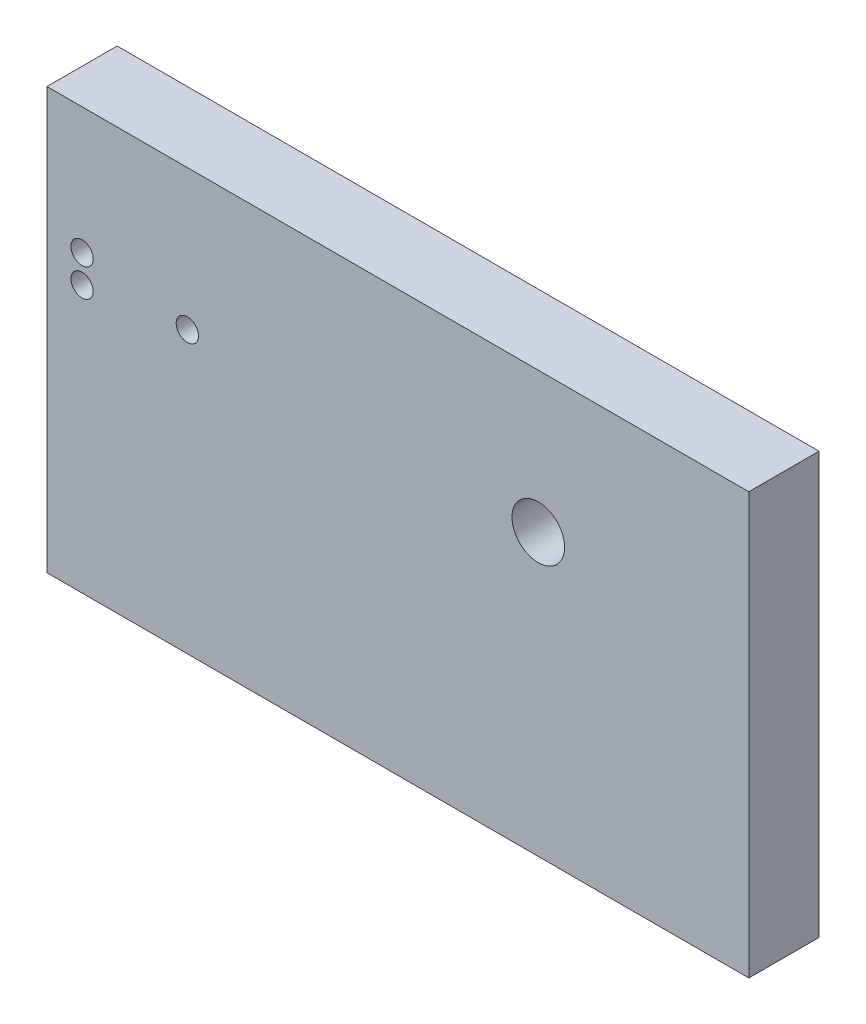
ISO-10303-21;
HEADER;
FILE_DESCRIPTION(('STEP AP214'),'2;1');
FILE_NAME('part.step','',(''),(''),'','','');
FILE_SCHEMA(('AUTOMOTIVE_DESIGN { 1 0 10303 214 1 1 1 1 }'));
ENDSEC;
DATA;
#1=APPLICATION_CONTEXT('core data for automotive mechanical design processes');
#2=APPLICATION_PROTOCOL_DEFINITION('international standard','automotive_design',2000,#1);
#3=PRODUCT_CONTEXT('',#1,'mechanical');
#4=PRODUCT('Part','Part','',(#3));
#5=PRODUCT_RELATED_PRODUCT_CATEGORY('part','',(#4));
#6=PRODUCT_DEFINITION_FORMATION('','',#4);
#7=PRODUCT_DEFINITION_CONTEXT('part definition',#1,'design');
#8=PRODUCT_DEFINITION('design','',#6,#7);
#9=PRODUCT_DEFINITION_SHAPE('','',#8);
#10=(LENGTH_UNIT() NAMED_UNIT(*) SI_UNIT(.MILLI.,.METRE.));
#11=(NAMED_UNIT(*) PLANE_ANGLE_UNIT() SI_UNIT($,.RADIAN.));
#12=(NAMED_UNIT(*) SI_UNIT($,.STERADIAN.) SOLID_ANGLE_UNIT());
#13=UNCERTAINTY_MEASURE_WITH_UNIT(LENGTH_MEASURE(1.E-05),#10,'distance_accuracy_value','');
#14=(GEOMETRIC_REPRESENTATION_CONTEXT(3) GLOBAL_UNCERTAINTY_ASSIGNED_CONTEXT((#13)) GLOBAL_UNIT_ASSIGNED_CONTEXT((#10,
#11,#12)) REPRESENTATION_CONTEXT('',''));
#15=CARTESIAN_POINT('',(0.,0.,0.));
#16=DIRECTION('',(0.,0.,1.));
#17=DIRECTION('',(1.,0.,0.));
#18=AXIS2_PLACEMENT_3D('',#15,#16,#17);
#19=CARTESIAN_POINT('',(0.,76.2,12.7));
#20=DIRECTION('',(0.,1.,0.));
#21=DIRECTION('',(0.,0.,1.));
#22=AXIS2_PLACEMENT_3D('',#19,#20,#21);
#23=PLANE('',#22);
#24=DIRECTION('',(1.,0.,0.));
#25=VECTOR('',#24,1.);
#26=CARTESIAN_POINT('',(0.,76.2,0.));
#27=LINE('',#26,#25);
#28=CARTESIAN_POINT('',(0.,76.2,0.));
#29=VERTEX_POINT('',#28);
#30=CARTESIAN_POINT('',(127.,76.2,0.));
#31=VERTEX_POINT('',#30);
#32=EDGE_CURVE('E132',#29,#31,#27,.T.);
#33=ORIENTED_EDGE('',*,*,#32,.F.);
#34=DIRECTION('',(0.,0.,-1.));
#35=VECTOR('',#34,1.);
#36=CARTESIAN_POINT('',(0.,76.2,12.7));
#37=LINE('',#36,#35);
#38=CARTESIAN_POINT('',(0.,76.2,12.7));
#39=VERTEX_POINT('',#38);
#40=EDGE_CURVE('E11',#39,#29,#37,.T.);
#41=ORIENTED_EDGE('',*,*,#40,.F.);
#42=DIRECTION('',(1.,0.,0.));
#43=VECTOR('',#42,1.);
#44=CARTESIAN_POINT('',(0.,76.2,12.7));
#45=LINE('',#44,#43);
#46=CARTESIAN_POINT('',(127.,76.2,12.7));
#47=VERTEX_POINT('',#46);
#48=EDGE_CURVE('E133',#39,#47,#45,.T.);
#49=ORIENTED_EDGE('',*,*,#48,.T.);
#50=DIRECTION('',(0.,0.,-1.));
#51=VECTOR('',#50,1.);
#52=CARTESIAN_POINT('',(127.,76.2,12.7));
#53=LINE('',#52,#51);
#54=EDGE_CURVE('E48',#47,#31,#53,.T.);
#55=ORIENTED_EDGE('',*,*,#54,.T.);
#56=EDGE_LOOP('',(#33,#41,#49,#55));
#57=FACE_BOUND('',#56,.T.);
#58=ADVANCED_FACE('F45',(#57),#23,.T.);
#59=CARTESIAN_POINT('',(0.,0.,12.7));
#60=DIRECTION('',(-1.,0.,0.));
#61=DIRECTION('',(0.,0.,1.));
#62=AXIS2_PLACEMENT_3D('',#59,#60,#61);
#63=PLANE('',#62);
#64=DIRECTION('',(0.,1.,0.));
#65=VECTOR('',#64,1.);
#66=CARTESIAN_POINT('',(0.,0.,0.));
#67=LINE('',#66,#65);
#68=CARTESIAN_POINT('',(0.,0.,0.));
#69=VERTEX_POINT('',#68);
#70=EDGE_CURVE('E136',#69,#29,#67,.T.);
#71=ORIENTED_EDGE('',*,*,#70,.F.);
#72=DIRECTION('',(0.,0.,-1.));
#73=VECTOR('',#72,1.);
#74=CARTESIAN_POINT('',(0.,0.,12.7));
#75=LINE('',#74,#73);
#76=CARTESIAN_POINT('',(0.,0.,12.7));
#77=VERTEX_POINT('',#76);
#78=EDGE_CURVE('E55',#77,#69,#75,.T.);
#79=ORIENTED_EDGE('',*,*,#78,.F.);
#80=DIRECTION('',(0.,1.,0.));
#81=VECTOR('',#80,1.);
#82=CARTESIAN_POINT('',(0.,0.,12.7));
#83=LINE('',#82,#81);
#84=EDGE_CURVE('E142',#77,#39,#83,.T.);
#85=ORIENTED_EDGE('',*,*,#84,.T.);
#86=ORIENTED_EDGE('',*,*,#40,.T.);
#87=EDGE_LOOP('',(#71,#79,#85,#86));
#88=FACE_BOUND('',#87,.T.);
#89=ADVANCED_FACE('F169',(#88),#63,.T.);
#90=CARTESIAN_POINT('',(0.,0.,12.7));
#91=DIRECTION('',(0.,1.,0.));
#92=DIRECTION('',(0.,0.,1.));
#93=AXIS2_PLACEMENT_3D('',#90,#91,#92);
#94=PLANE('',#93);
#95=CARTESIAN_POINT('',(19.05,0.,6.35000000000027));
#96=DIRECTION('',(0.,-1.,0.));
#97=DIRECTION('',(0.,0.,-1.));
#98=AXIS2_PLACEMENT_3D('',#95,#96,#97);
#99=CIRCLE('',#98,2.01929999999999);
#100=CARTESIAN_POINT('',(19.05,0.,4.33070000000029));
#101=VERTEX_POINT('',#100);
#102=EDGE_CURVE('E109',#101,#101,#99,.T.);
#103=ORIENTED_EDGE('',*,*,#102,.F.);
#104=EDGE_LOOP('',(#103));
#105=FACE_BOUND('',#104,.T.);
#106=CARTESIAN_POINT('',(107.95,0.,6.34999999999974));
#107=DIRECTION('',(0.,-1.,0.));
#108=DIRECTION('',(0.,0.,-1.));
#109=AXIS2_PLACEMENT_3D('',#106,#107,#108);
#110=CIRCLE('',#109,2.01929999999999);
#111=CARTESIAN_POINT('',(107.95,0.,4.33069999999975));
#112=VERTEX_POINT('',#111);
#113=EDGE_CURVE('E108',#112,#112,#110,.T.);
#114=ORIENTED_EDGE('',*,*,#113,.F.);
#115=EDGE_LOOP('',(#114));
#116=FACE_BOUND('',#115,.T.);
#117=DIRECTION('',(1.,0.,0.));
#118=VECTOR('',#117,1.);
#119=CARTESIAN_POINT('',(0.,0.,0.));
#120=LINE('',#119,#118);
#121=CARTESIAN_POINT('',(127.,0.,0.));
#122=VERTEX_POINT('',#121);
#123=EDGE_CURVE('E152',#69,#122,#120,.T.);
#124=ORIENTED_EDGE('',*,*,#123,.T.);
#125=DIRECTION('',(0.,0.,-1.));
#126=VECTOR('',#125,1.);
#127=CARTESIAN_POINT('',(127.,0.,12.7));
#128=LINE('',#127,#126);
#129=CARTESIAN_POINT('',(127.,0.,12.7));
#130=VERTEX_POINT('',#129);
#131=EDGE_CURVE('E159',#130,#122,#128,.T.);
#132=ORIENTED_EDGE('',*,*,#131,.F.);
#133=DIRECTION('',(1.,0.,0.));
#134=VECTOR('',#133,1.);
#135=CARTESIAN_POINT('',(0.,0.,12.7));
#136=LINE('',#135,#134);
#137=EDGE_CURVE('E139',#77,#130,#136,.T.);
#138=ORIENTED_EDGE('',*,*,#137,.F.);
#139=ORIENTED_EDGE('',*,*,#78,.T.);
#140=EDGE_LOOP('',(#124,#132,#138,#139));
#141=FACE_BOUND('',#140,.T.);
#142=ADVANCED_FACE('F171',(#105,#116,#141),#94,.F.);
#143=CARTESIAN_POINT('',(127.,0.,12.7));
#144=DIRECTION('',(-1.,0.,0.));
#145=DIRECTION('',(0.,0.,1.));
#146=AXIS2_PLACEMENT_3D('',#143,#144,#145);
#147=PLANE('',#146);
#148=DIRECTION('',(0.,1.,0.));
#149=VECTOR('',#148,1.);
#150=CARTESIAN_POINT('',(127.,0.,0.));
#151=LINE('',#150,#149);
#152=EDGE_CURVE('E148',#122,#31,#151,.T.);
#153=ORIENTED_EDGE('',*,*,#152,.T.);
#154=ORIENTED_EDGE('',*,*,#54,.F.);
#155=DIRECTION('',(0.,1.,0.));
#156=VECTOR('',#155,1.);
#157=CARTESIAN_POINT('',(127.,0.,12.7));
#158=LINE('',#157,#156);
#159=EDGE_CURVE('E89',#130,#47,#158,.T.);
#160=ORIENTED_EDGE('',*,*,#159,.F.);
#161=ORIENTED_EDGE('',*,*,#131,.T.);
#162=EDGE_LOOP('',(#153,#154,#160,#161));
#163=FACE_BOUND('',#162,.T.);
#164=ADVANCED_FACE('F166',(#163),#147,.F.);
#165=CARTESIAN_POINT('',(0.,0.,12.7));
#166=DIRECTION('',(0.,0.,1.));
#167=DIRECTION('',(1.,0.,0.));
#168=AXIS2_PLACEMENT_3D('',#165,#166,#167);
#169=PLANE('',#168);
#170=CARTESIAN_POINT('',(6.35,53.34,12.7));
#171=DIRECTION('',(0.,0.,1.));
#172=DIRECTION('',(1.,0.,0.));
#173=AXIS2_PLACEMENT_3D('',#170,#171,#172);
#174=CIRCLE('',#173,2.0193);
#175=CARTESIAN_POINT('',(8.3693,53.34,12.7));
#176=VERTEX_POINT('',#175);
#177=EDGE_CURVE('E339',#176,#176,#174,.T.);
#178=ORIENTED_EDGE('',*,*,#177,.F.);
#179=EDGE_LOOP('',(#178));
#180=FACE_BOUND('',#179,.T.);
#181=CARTESIAN_POINT('',(6.35,48.26,12.7));
#182=DIRECTION('',(0.,0.,1.));
#183=DIRECTION('',(1.,0.,0.));
#184=AXIS2_PLACEMENT_3D('',#181,#182,#183);
#185=CIRCLE('',#184,2.01929999999999);
#186=CARTESIAN_POINT('',(8.36929999999999,48.26,12.7));
#187=VERTEX_POINT('',#186);
#188=EDGE_CURVE('E344',#187,#187,#185,.T.);
#189=ORIENTED_EDGE('',*,*,#188,.F.);
#190=EDGE_LOOP('',(#189));
#191=FACE_BOUND('',#190,.T.);
#192=CARTESIAN_POINT('',(88.9,50.8,12.7));
#193=DIRECTION('',(0.,0.,1.));
#194=DIRECTION('',(1.,0.,0.));
#195=AXIS2_PLACEMENT_3D('',#192,#193,#194);
#196=CIRCLE('',#195,4.7625);
#197=CARTESIAN_POINT('',(93.6625,50.8,12.7));
#198=VERTEX_POINT('',#197);
#199=EDGE_CURVE('E356',#198,#198,#196,.T.);
#200=ORIENTED_EDGE('',*,*,#199,.F.);
#201=EDGE_LOOP('',(#200));
#202=FACE_BOUND('',#201,.T.);
#203=CARTESIAN_POINT('',(25.4,50.8,12.7));
#204=DIRECTION('',(0.,0.,1.));
#205=DIRECTION('',(1.,0.,0.));
#206=AXIS2_PLACEMENT_3D('',#203,#204,#205);
#207=CIRCLE('',#206,2.0193);
#208=CARTESIAN_POINT('',(27.4193,50.8,12.7));
#209=VERTEX_POINT('',#208);
#210=EDGE_CURVE('E124',#209,#209,#207,.T.);
#211=ORIENTED_EDGE('',*,*,#210,.F.);
#212=EDGE_LOOP('',(#211));
#213=FACE_BOUND('',#212,.T.);
#214=ORIENTED_EDGE('',*,*,#48,.F.);
#215=ORIENTED_EDGE('',*,*,#84,.F.);
#216=ORIENTED_EDGE('',*,*,#137,.T.);
#217=ORIENTED_EDGE('',*,*,#159,.T.);
#218=EDGE_LOOP('',(#214,#215,#216,#217));
#219=FACE_BOUND('',#218,.T.);
#220=ADVANCED_FACE('F172',(#180,#191,#202,#213,#219),#169,.T.);
#221=CARTESIAN_POINT('',(0.,0.,0.));
#222=DIRECTION('',(0.,0.,1.));
#223=DIRECTION('',(1.,0.,0.));
#224=AXIS2_PLACEMENT_3D('',#221,#222,#223);
#225=PLANE('',#224);
#226=CARTESIAN_POINT('',(6.35,53.34,0.));
#227=DIRECTION('',(0.,0.,1.));
#228=DIRECTION('',(1.,0.,0.));
#229=AXIS2_PLACEMENT_3D('',#226,#227,#228);
#230=CIRCLE('',#229,2.0193);
#231=CARTESIAN_POINT('',(8.3693,53.34,0.));
#232=VERTEX_POINT('',#231);
#233=EDGE_CURVE('E342',#232,#232,#230,.T.);
#234=ORIENTED_EDGE('',*,*,#233,.T.);
#235=EDGE_LOOP('',(#234));
#236=FACE_BOUND('',#235,.T.);
#237=CARTESIAN_POINT('',(6.35,48.26,0.));
#238=DIRECTION('',(0.,0.,1.));
#239=DIRECTION('',(1.,0.,0.));
#240=AXIS2_PLACEMENT_3D('',#237,#238,#239);
#241=CIRCLE('',#240,2.01929999999999);
#242=CARTESIAN_POINT('',(8.36929999999999,48.26,0.));
#243=VERTEX_POINT('',#242);
#244=EDGE_CURVE('E349',#243,#243,#241,.T.);
#245=ORIENTED_EDGE('',*,*,#244,.T.);
#246=EDGE_LOOP('',(#245));
#247=FACE_BOUND('',#246,.T.);
#248=CARTESIAN_POINT('',(88.9,50.8,0.));
#249=DIRECTION('',(0.,0.,1.));
#250=DIRECTION('',(1.,0.,0.));
#251=AXIS2_PLACEMENT_3D('',#248,#249,#250);
#252=CIRCLE('',#251,4.76249999999999);
#253=CARTESIAN_POINT('',(93.6625,50.8,0.));
#254=VERTEX_POINT('',#253);
#255=EDGE_CURVE('E117',#254,#254,#252,.T.);
#256=ORIENTED_EDGE('',*,*,#255,.T.);
#257=EDGE_LOOP('',(#256));
#258=FACE_BOUND('',#257,.T.);
#259=CARTESIAN_POINT('',(25.4,50.8,0.));
#260=DIRECTION('',(0.,0.,1.));
#261=DIRECTION('',(1.,0.,0.));
#262=AXIS2_PLACEMENT_3D('',#259,#260,#261);
#263=CIRCLE('',#262,2.0193);
#264=CARTESIAN_POINT('',(27.4193,50.8,0.));
#265=VERTEX_POINT('',#264);
#266=EDGE_CURVE('E128',#265,#265,#263,.T.);
#267=ORIENTED_EDGE('',*,*,#266,.T.);
#268=EDGE_LOOP('',(#267));
#269=FACE_BOUND('',#268,.T.);
#270=ORIENTED_EDGE('',*,*,#32,.T.);
#271=ORIENTED_EDGE('',*,*,#152,.F.);
#272=ORIENTED_EDGE('',*,*,#123,.F.);
#273=ORIENTED_EDGE('',*,*,#70,.T.);
#274=EDGE_LOOP('',(#270,#271,#272,#273));
#275=FACE_BOUND('',#274,.T.);
#276=ADVANCED_FACE('F168',(#236,#247,#258,#269,#275),#225,.F.);
#277=CARTESIAN_POINT('',(25.4,50.8,12.7));
#278=DIRECTION('',(0.,0.,1.));
#279=DIRECTION('',(1.,0.,0.));
#280=AXIS2_PLACEMENT_3D('',#277,#278,#279);
#281=CYLINDRICAL_SURFACE('',#280,2.0193);
#282=ORIENTED_EDGE('',*,*,#266,.F.);
#283=EDGE_LOOP('',(#282));
#284=FACE_BOUND('',#283,.T.);
#285=ORIENTED_EDGE('',*,*,#210,.T.);
#286=EDGE_LOOP('',(#285));
#287=FACE_BOUND('',#286,.T.);
#288=ADVANCED_FACE('F180',(#284,#287),#281,.F.);
#289=CARTESIAN_POINT('',(107.95,11.4866821519976,6.34999999999974));
#290=DIRECTION('',(0.,-1.,0.));
#291=DIRECTION('',(0.,0.,-1.));
#292=AXIS2_PLACEMENT_3D('',#289,#290,#291);
#293=CONICAL_SURFACE('',#292,2.0193,1.02974425867665);
#294=CARTESIAN_POINT('',(107.95,12.7,6.34999999999974));
#295=VERTEX_POINT('',#294);
#296=VERTEX_LOOP('',#295);
#297=FACE_BOUND('',#296,.T.);
#298=CARTESIAN_POINT('',(107.95,11.4866821519976,6.34999999999974));
#299=DIRECTION('',(0.,-1.,0.));
#300=DIRECTION('',(0.,0.,-1.));
#301=AXIS2_PLACEMENT_3D('',#298,#299,#300);
#302=CIRCLE('',#301,2.0193);
#303=CARTESIAN_POINT('',(107.95,11.4866821519976,4.33069999999974));
#304=VERTEX_POINT('',#303);
#305=EDGE_CURVE('E114',#304,#304,#302,.T.);
#306=ORIENTED_EDGE('',*,*,#305,.T.);
#307=EDGE_LOOP('',(#306));
#308=FACE_BOUND('',#307,.T.);
#309=ADVANCED_FACE('F203',(#297,#308),#293,.F.);
#310=CARTESIAN_POINT('',(107.95,0.,6.34999999999974));
#311=DIRECTION('',(0.,-1.,0.));
#312=DIRECTION('',(0.,0.,-1.));
#313=AXIS2_PLACEMENT_3D('',#310,#311,#312);
#314=CYLINDRICAL_SURFACE('',#313,2.01929999999999);
#315=ORIENTED_EDGE('',*,*,#305,.F.);
#316=EDGE_LOOP('',(#315));
#317=FACE_BOUND('',#316,.T.);
#318=ORIENTED_EDGE('',*,*,#113,.T.);
#319=EDGE_LOOP('',(#318));
#320=FACE_BOUND('',#319,.T.);
#321=ADVANCED_FACE('F101',(#317,#320),#314,.F.);
#322=CARTESIAN_POINT('',(19.05,11.4866821519976,6.35000000000027));
#323=DIRECTION('',(0.,-1.,0.));
#324=DIRECTION('',(0.,0.,-1.));
#325=AXIS2_PLACEMENT_3D('',#322,#323,#324);
#326=CONICAL_SURFACE('',#325,2.0193,1.02974425867665);
#327=CARTESIAN_POINT('',(19.05,12.7,6.35000000000027));
#328=VERTEX_POINT('',#327);
#329=VERTEX_LOOP('',#328);
#330=FACE_BOUND('',#329,.T.);
#331=CARTESIAN_POINT('',(19.05,11.4866821519976,6.35000000000027));
#332=DIRECTION('',(0.,-1.,0.));
#333=DIRECTION('',(0.,0.,-1.));
#334=AXIS2_PLACEMENT_3D('',#331,#332,#333);
#335=CIRCLE('',#334,2.0193);
#336=CARTESIAN_POINT('',(19.05,11.4866821519976,4.33070000000028));
#337=VERTEX_POINT('',#336);
#338=EDGE_CURVE('E105',#337,#337,#335,.T.);
#339=ORIENTED_EDGE('',*,*,#338,.T.);
#340=EDGE_LOOP('',(#339));
#341=FACE_BOUND('',#340,.T.);
#342=ADVANCED_FACE('F97',(#330,#341),#326,.F.);
#343=CARTESIAN_POINT('',(19.05,0.,6.35000000000027));
#344=DIRECTION('',(0.,-1.,0.));
#345=DIRECTION('',(0.,0.,-1.));
#346=AXIS2_PLACEMENT_3D('',#343,#344,#345);
#347=CYLINDRICAL_SURFACE('',#346,2.01929999999999);
#348=ORIENTED_EDGE('',*,*,#338,.F.);
#349=EDGE_LOOP('',(#348));
#350=FACE_BOUND('',#349,.T.);
#351=ORIENTED_EDGE('',*,*,#102,.T.);
#352=EDGE_LOOP('',(#351));
#353=FACE_BOUND('',#352,.T.);
#354=ADVANCED_FACE('F100',(#350,#353),#347,.F.);
#355=CARTESIAN_POINT('',(88.9,50.8,12.7));
#356=DIRECTION('',(0.,0.,1.));
#357=DIRECTION('',(1.,0.,0.));
#358=AXIS2_PLACEMENT_3D('',#355,#356,#357);
#359=CYLINDRICAL_SURFACE('',#358,4.7625);
#360=ORIENTED_EDGE('',*,*,#255,.F.);
#361=EDGE_LOOP('',(#360));
#362=FACE_BOUND('',#361,.T.);
#363=ORIENTED_EDGE('',*,*,#199,.T.);
#364=EDGE_LOOP('',(#363));
#365=FACE_BOUND('',#364,.T.);
#366=ADVANCED_FACE('F257',(#362,#365),#359,.F.);
#367=CARTESIAN_POINT('',(6.35,48.26,12.7));
#368=DIRECTION('',(0.,0.,1.));
#369=DIRECTION('',(1.,0.,0.));
#370=AXIS2_PLACEMENT_3D('',#367,#368,#369);
#371=CYLINDRICAL_SURFACE('',#370,2.01929999999999);
#372=ORIENTED_EDGE('',*,*,#188,.T.);
#373=EDGE_LOOP('',(#372));
#374=FACE_BOUND('',#373,.T.);
#375=ORIENTED_EDGE('',*,*,#244,.F.);
#376=EDGE_LOOP('',(#375));
#377=FACE_BOUND('',#376,.T.);
#378=ADVANCED_FACE('F267',(#374,#377),#371,.F.);
#379=CARTESIAN_POINT('',(6.35,53.34,12.7));
#380=DIRECTION('',(0.,0.,1.));
#381=DIRECTION('',(1.,0.,0.));
#382=AXIS2_PLACEMENT_3D('',#379,#380,#381);
#383=CYLINDRICAL_SURFACE('',#382,2.0193);
#384=ORIENTED_EDGE('',*,*,#177,.T.);
#385=EDGE_LOOP('',(#384));
#386=FACE_BOUND('',#385,.T.);
#387=ORIENTED_EDGE('',*,*,#233,.F.);
#388=EDGE_LOOP('',(#387));
#389=FACE_BOUND('',#388,.T.);
#390=ADVANCED_FACE('F276',(#386,#389),#383,.F.);
#391=CLOSED_SHELL('',(#58,#89,#142,#164,#220,#276,#288,#309,#321,#342,#354,#366,#378,#390));
#392=MANIFOLD_SOLID_BREP('B2',#391);
#393=ADVANCED_BREP_SHAPE_REPRESENTATION('',(#18,#392),#14);
#394=SHAPE_DEFINITION_REPRESENTATION(#9,#393);
ENDSEC;
END-ISO-10303-21;
